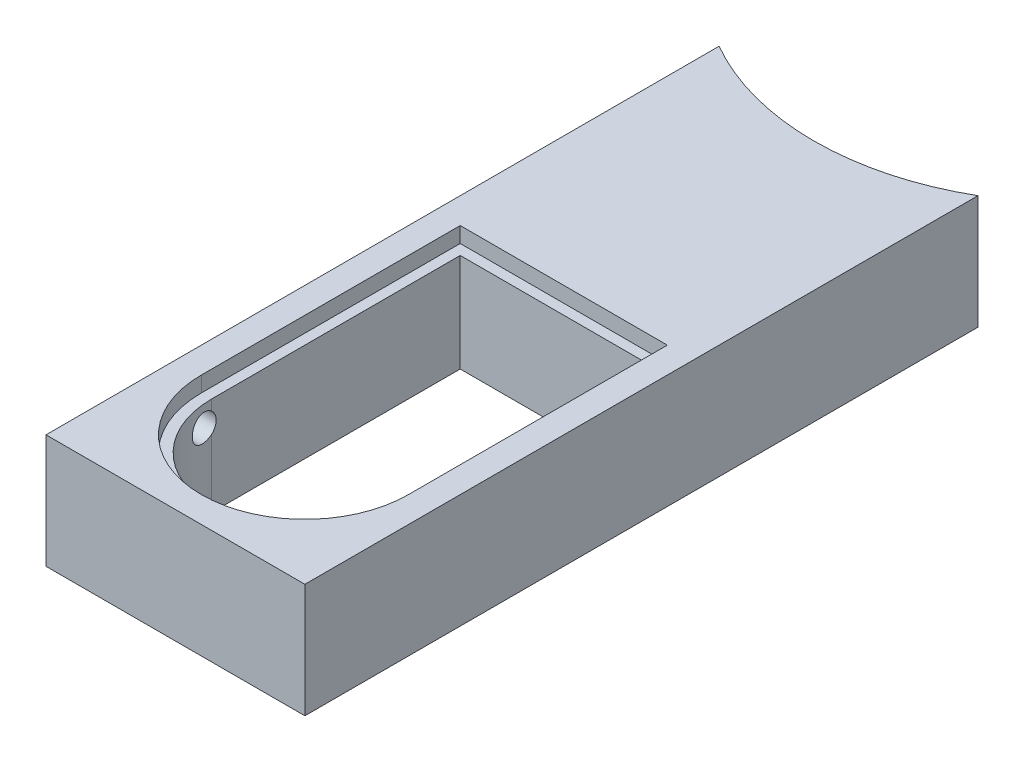
ISO-10303-21;
HEADER;
FILE_DESCRIPTION(('STEP AP214'),'2;1');
FILE_NAME('part.step','',(''),(''),'','','');
FILE_SCHEMA(('AUTOMOTIVE_DESIGN { 1 0 10303 214 1 1 1 1 }'));
ENDSEC;
DATA;
#1=APPLICATION_CONTEXT('core data for automotive mechanical design processes');
#2=APPLICATION_PROTOCOL_DEFINITION('international standard','automotive_design',2000,#1);
#3=PRODUCT_CONTEXT('',#1,'mechanical');
#4=PRODUCT('Part','Part','',(#3));
#5=PRODUCT_RELATED_PRODUCT_CATEGORY('part','',(#4));
#6=PRODUCT_DEFINITION_FORMATION('','',#4);
#7=PRODUCT_DEFINITION_CONTEXT('part definition',#1,'design');
#8=PRODUCT_DEFINITION('design','',#6,#7);
#9=PRODUCT_DEFINITION_SHAPE('','',#8);
#10=(LENGTH_UNIT() NAMED_UNIT(*) SI_UNIT(.MILLI.,.METRE.));
#11=(NAMED_UNIT(*) PLANE_ANGLE_UNIT() SI_UNIT($,.RADIAN.));
#12=(NAMED_UNIT(*) SI_UNIT($,.STERADIAN.) SOLID_ANGLE_UNIT());
#13=UNCERTAINTY_MEASURE_WITH_UNIT(LENGTH_MEASURE(1.E-05),#10,'distance_accuracy_value','');
#14=(GEOMETRIC_REPRESENTATION_CONTEXT(3) GLOBAL_UNCERTAINTY_ASSIGNED_CONTEXT((#13)) GLOBAL_UNIT_ASSIGNED_CONTEXT((#10,
#11,#12)) REPRESENTATION_CONTEXT('',''));
#15=CARTESIAN_POINT('',(0.,0.,0.));
#16=DIRECTION('',(0.,0.,1.));
#17=DIRECTION('',(1.,0.,0.));
#18=AXIS2_PLACEMENT_3D('',#15,#16,#17);
#19=CARTESIAN_POINT('',(0.,10.,0.));
#20=DIRECTION('',(0.,-1.,0.));
#21=DIRECTION('',(0.,0.,-1.));
#22=AXIS2_PLACEMENT_3D('',#19,#20,#21);
#23=CYLINDRICAL_SURFACE('',#22,20.);
#24=DIRECTION('',(0.,-1.,0.));
#25=VECTOR('',#24,1.);
#26=CARTESIAN_POINT('',(10.,10.,17.3205080756888));
#27=LINE('',#26,#25);
#28=CARTESIAN_POINT('',(10.,10.,17.3205080756888));
#29=VERTEX_POINT('',#28);
#30=CARTESIAN_POINT('',(10.,1.2,17.3205080756888));
#31=VERTEX_POINT('',#30);
#32=EDGE_CURVE('E245',#29,#31,#27,.T.);
#33=ORIENTED_EDGE('',*,*,#32,.T.);
#34=CARTESIAN_POINT('',(0.,1.2,0.));
#35=DIRECTION('',(0.,1.,0.));
#36=DIRECTION('',(0.,0.,-1.));
#37=AXIS2_PLACEMENT_3D('',#34,#35,#36);
#38=CIRCLE('',#37,20.);
#39=CARTESIAN_POINT('',(-9.99999999999999,1.2,17.3205080756888));
#40=VERTEX_POINT('',#39);
#41=EDGE_CURVE('E64',#40,#31,#38,.T.);
#42=ORIENTED_EDGE('',*,*,#41,.F.);
#43=DIRECTION('',(0.,-1.,0.));
#44=VECTOR('',#43,1.);
#45=CARTESIAN_POINT('',(-9.99999999999999,10.,17.3205080756888));
#46=LINE('',#45,#44);
#47=CARTESIAN_POINT('',(-9.99999999999999,10.,17.3205080756888));
#48=VERTEX_POINT('',#47);
#49=EDGE_CURVE('E51',#48,#40,#46,.T.);
#50=ORIENTED_EDGE('',*,*,#49,.F.);
#51=CARTESIAN_POINT('',(0.,10.,0.));
#52=DIRECTION('',(0.,1.,0.));
#53=DIRECTION('',(0.,0.,1.));
#54=AXIS2_PLACEMENT_3D('',#51,#52,#53);
#55=CIRCLE('',#54,20.);
#56=EDGE_CURVE('E234',#48,#29,#55,.T.);
#57=ORIENTED_EDGE('',*,*,#56,.T.);
#58=EDGE_LOOP('',(#33,#42,#50,#57));
#59=FACE_BOUND('',#58,.T.);
#60=ADVANCED_FACE('F38',(#59),#23,.F.);
#61=CARTESIAN_POINT('',(-10.,10.,0.));
#62=DIRECTION('',(1.,0.,0.));
#63=DIRECTION('',(0.,0.,-1.));
#64=AXIS2_PLACEMENT_3D('',#61,#62,#63);
#65=PLANE('',#64);
#66=CARTESIAN_POINT('',(-9.99999999999999,7.21457724078016,60.));
#67=DIRECTION('',(-1.,0.,0.));
#68=DIRECTION('',(0.,0.,1.));
#69=AXIS2_PLACEMENT_3D('',#66,#67,#68);
#70=CIRCLE('',#69,1.02499999999999);
#71=CARTESIAN_POINT('',(-9.99999999999999,7.21457724078016,61.025));
#72=VERTEX_POINT('',#71);
#73=EDGE_CURVE('E148',#72,#72,#70,.T.);
#74=ORIENTED_EDGE('',*,*,#73,.F.);
#75=EDGE_LOOP('',(#74));
#76=FACE_BOUND('',#75,.T.);
#77=DIRECTION('',(0.,0.,-1.));
#78=VECTOR('',#77,1.);
#79=CARTESIAN_POINT('',(-9.99999999999999,1.2,69.3205080756888));
#80=LINE('',#79,#78);
#81=CARTESIAN_POINT('',(-9.99999999999999,1.2,69.3205080756888));
#82=VERTEX_POINT('',#81);
#83=EDGE_CURVE('E261',#82,#40,#80,.T.);
#84=ORIENTED_EDGE('',*,*,#83,.F.);
#85=DIRECTION('',(0.,-1.,0.));
#86=VECTOR('',#85,1.);
#87=CARTESIAN_POINT('',(-9.99999999999999,10.,69.3205080756888));
#88=LINE('',#87,#86);
#89=CARTESIAN_POINT('',(-9.99999999999999,10.,69.3205080756888));
#90=VERTEX_POINT('',#89);
#91=EDGE_CURVE('E250',#90,#82,#88,.T.);
#92=ORIENTED_EDGE('',*,*,#91,.F.);
#93=DIRECTION('',(0.,0.,1.));
#94=VECTOR('',#93,1.);
#95=CARTESIAN_POINT('',(-10.,10.,0.));
#96=LINE('',#95,#94);
#97=EDGE_CURVE('E236',#48,#90,#96,.T.);
#98=ORIENTED_EDGE('',*,*,#97,.F.);
#99=ORIENTED_EDGE('',*,*,#49,.T.);
#100=EDGE_LOOP('',(#84,#92,#98,#99));
#101=FACE_BOUND('',#100,.T.);
#102=ADVANCED_FACE('F260',(#76,#101),#65,.F.);
#103=CARTESIAN_POINT('',(0.,10.,69.3205080756888));
#104=DIRECTION('',(0.,0.,-1.));
#105=DIRECTION('',(-1.,0.,0.));
#106=AXIS2_PLACEMENT_3D('',#103,#104,#105);
#107=PLANE('',#106);
#108=DIRECTION('',(-1.,0.,0.));
#109=VECTOR('',#108,1.);
#110=CARTESIAN_POINT('',(10.,1.2,69.3205080756888));
#111=LINE('',#110,#109);
#112=CARTESIAN_POINT('',(10.,1.2,69.3205080756888));
#113=VERTEX_POINT('',#112);
#114=EDGE_CURVE('E147',#113,#82,#111,.T.);
#115=ORIENTED_EDGE('',*,*,#114,.F.);
#116=DIRECTION('',(0.,-1.,0.));
#117=VECTOR('',#116,1.);
#118=CARTESIAN_POINT('',(10.,10.,69.3205080756888));
#119=LINE('',#118,#117);
#120=CARTESIAN_POINT('',(10.,10.,69.3205080756888));
#121=VERTEX_POINT('',#120);
#122=EDGE_CURVE('E248',#121,#113,#119,.T.);
#123=ORIENTED_EDGE('',*,*,#122,.F.);
#124=DIRECTION('',(1.,0.,0.));
#125=VECTOR('',#124,1.);
#126=CARTESIAN_POINT('',(0.,10.,69.3205080756888));
#127=LINE('',#126,#125);
#128=EDGE_CURVE('E240',#90,#121,#127,.T.);
#129=ORIENTED_EDGE('',*,*,#128,.F.);
#130=ORIENTED_EDGE('',*,*,#91,.T.);
#131=EDGE_LOOP('',(#115,#123,#129,#130));
#132=FACE_BOUND('',#131,.T.);
#133=ADVANCED_FACE('F331',(#132),#107,.F.);
#134=CARTESIAN_POINT('',(9.99999999999999,10.,0.));
#135=DIRECTION('',(1.,0.,0.));
#136=DIRECTION('',(0.,0.,-1.));
#137=AXIS2_PLACEMENT_3D('',#134,#135,#136);
#138=PLANE('',#137);
#139=ORIENTED_EDGE('',*,*,#122,.T.);
#140=DIRECTION('',(0.,0.,1.));
#141=VECTOR('',#140,1.);
#142=CARTESIAN_POINT('',(10.,1.2,69.3205080756888));
#143=LINE('',#142,#141);
#144=EDGE_CURVE('E265',#31,#113,#143,.T.);
#145=ORIENTED_EDGE('',*,*,#144,.F.);
#146=ORIENTED_EDGE('',*,*,#32,.F.);
#147=DIRECTION('',(0.,0.,1.));
#148=VECTOR('',#147,1.);
#149=CARTESIAN_POINT('',(9.99999999999999,10.,0.));
#150=LINE('',#149,#148);
#151=EDGE_CURVE('E242',#29,#121,#150,.T.);
#152=ORIENTED_EDGE('',*,*,#151,.T.);
#153=EDGE_LOOP('',(#139,#145,#146,#152));
#154=FACE_BOUND('',#153,.T.);
#155=ADVANCED_FACE('F336',(#154),#138,.T.);
#156=CARTESIAN_POINT('',(0.,10.,0.));
#157=DIRECTION('',(0.,1.,0.));
#158=DIRECTION('',(0.,0.,1.));
#159=AXIS2_PLACEMENT_3D('',#156,#157,#158);
#160=PLANE('',#159);
#161=DIRECTION('',(1.,0.,0.));
#162=VECTOR('',#161,1.);
#163=CARTESIAN_POINT('',(0.,10.,39.3205080756888));
#164=LINE('',#163,#162);
#165=CARTESIAN_POINT('',(-8.,10.,39.3205080756888));
#166=VERTEX_POINT('',#165);
#167=CARTESIAN_POINT('',(8.,10.,39.3205080756888));
#168=VERTEX_POINT('',#167);
#169=EDGE_CURVE('E198',#166,#168,#164,.T.);
#170=ORIENTED_EDGE('',*,*,#169,.T.);
#171=DIRECTION('',(0.,0.,-1.));
#172=VECTOR('',#171,1.);
#173=CARTESIAN_POINT('',(8.,10.,0.));
#174=LINE('',#173,#172);
#175=CARTESIAN_POINT('',(8.,10.,59.3205080756888));
#176=VERTEX_POINT('',#175);
#177=EDGE_CURVE('E187',#176,#168,#174,.T.);
#178=ORIENTED_EDGE('',*,*,#177,.F.);
#179=CARTESIAN_POINT('',(0.,10.,59.3205080756888));
#180=DIRECTION('',(0.,1.,0.));
#181=DIRECTION('',(0.,0.,1.));
#182=AXIS2_PLACEMENT_3D('',#179,#180,#181);
#183=CIRCLE('',#182,8.);
#184=CARTESIAN_POINT('',(-8.,10.,59.3205080756888));
#185=VERTEX_POINT('',#184);
#186=EDGE_CURVE('E231',#185,#176,#183,.T.);
#187=ORIENTED_EDGE('',*,*,#186,.F.);
#188=DIRECTION('',(0.,0.,-1.));
#189=VECTOR('',#188,1.);
#190=CARTESIAN_POINT('',(-8.,10.,0.));
#191=LINE('',#190,#189);
#192=EDGE_CURVE('E193',#185,#166,#191,.T.);
#193=ORIENTED_EDGE('',*,*,#192,.T.);
#194=EDGE_LOOP('',(#170,#178,#187,#193));
#195=FACE_BOUND('',#194,.T.);
#196=ORIENTED_EDGE('',*,*,#56,.F.);
#197=ORIENTED_EDGE('',*,*,#97,.T.);
#198=ORIENTED_EDGE('',*,*,#128,.T.);
#199=ORIENTED_EDGE('',*,*,#151,.F.);
#200=EDGE_LOOP('',(#196,#197,#198,#199));
#201=FACE_BOUND('',#200,.T.);
#202=ADVANCED_FACE('F228',(#195,#201),#160,.T.);
#203=CARTESIAN_POINT('',(0.,1.2,39.3205080756888));
#204=DIRECTION('',(0.,0.,1.));
#205=DIRECTION('',(1.,0.,0.));
#206=AXIS2_PLACEMENT_3D('',#203,#204,#205);
#207=PLANE('',#206);
#208=DIRECTION('',(0.,1.,0.));
#209=VECTOR('',#208,1.);
#210=CARTESIAN_POINT('',(8.,1.2,39.3205080756888));
#211=LINE('',#210,#209);
#212=CARTESIAN_POINT('',(8.,8.8,39.3205080756888));
#213=VERTEX_POINT('',#212);
#214=EDGE_CURVE('E171',#213,#168,#211,.T.);
#215=ORIENTED_EDGE('',*,*,#214,.T.);
#216=ORIENTED_EDGE('',*,*,#169,.F.);
#217=DIRECTION('',(0.,1.,0.));
#218=VECTOR('',#217,1.);
#219=CARTESIAN_POINT('',(-8.,1.2,39.3205080756888));
#220=LINE('',#219,#218);
#221=CARTESIAN_POINT('',(-8.,8.8,39.3205080756888));
#222=VERTEX_POINT('',#221);
#223=EDGE_CURVE('E185',#222,#166,#220,.T.);
#224=ORIENTED_EDGE('',*,*,#223,.F.);
#225=DIRECTION('',(-1.,0.,0.));
#226=VECTOR('',#225,1.);
#227=CARTESIAN_POINT('',(-8.,8.8,39.3205080756888));
#228=LINE('',#227,#226);
#229=EDGE_CURVE('E164',#213,#222,#228,.T.);
#230=ORIENTED_EDGE('',*,*,#229,.F.);
#231=EDGE_LOOP('',(#215,#216,#224,#230));
#232=FACE_BOUND('',#231,.T.);
#233=ADVANCED_FACE('F225',(#232),#207,.T.);
#234=CARTESIAN_POINT('',(0.,0.,59.3205080756888));
#235=DIRECTION('',(0.,1.,0.));
#236=DIRECTION('',(0.,0.,1.));
#237=AXIS2_PLACEMENT_3D('',#234,#235,#236);
#238=CYLINDRICAL_SURFACE('',#237,8.);
#239=DIRECTION('',(0.,1.,0.));
#240=VECTOR('',#239,1.);
#241=CARTESIAN_POINT('',(8.,1.2,59.3205080756888));
#242=LINE('',#241,#240);
#243=CARTESIAN_POINT('',(8.,8.8,59.3205080756888));
#244=VERTEX_POINT('',#243);
#245=EDGE_CURVE('E168',#244,#176,#242,.T.);
#246=ORIENTED_EDGE('',*,*,#245,.F.);
#247=CARTESIAN_POINT('',(0.,8.8,59.3205080756888));
#248=DIRECTION('',(0.,1.,0.));
#249=DIRECTION('',(0.,0.,1.));
#250=AXIS2_PLACEMENT_3D('',#247,#248,#249);
#251=CIRCLE('',#250,8.);
#252=CARTESIAN_POINT('',(-8.,8.8,59.3205080756888));
#253=VERTEX_POINT('',#252);
#254=EDGE_CURVE('E208',#253,#244,#251,.T.);
#255=ORIENTED_EDGE('',*,*,#254,.F.);
#256=DIRECTION('',(0.,1.,0.));
#257=VECTOR('',#256,1.);
#258=CARTESIAN_POINT('',(-8.,1.2,59.3205080756888));
#259=LINE('',#258,#257);
#260=EDGE_CURVE('E172',#253,#185,#259,.T.);
#261=ORIENTED_EDGE('',*,*,#260,.T.);
#262=ORIENTED_EDGE('',*,*,#186,.T.);
#263=EDGE_LOOP('',(#246,#255,#261,#262));
#264=FACE_BOUND('',#263,.T.);
#265=ADVANCED_FACE('F344',(#264),#238,.F.);
#266=CARTESIAN_POINT('',(8.,1.2,0.));
#267=DIRECTION('',(1.,0.,0.));
#268=DIRECTION('',(0.,0.,-1.));
#269=AXIS2_PLACEMENT_3D('',#266,#267,#268);
#270=PLANE('',#269);
#271=ORIENTED_EDGE('',*,*,#214,.F.);
#272=DIRECTION('',(0.,0.,-1.));
#273=VECTOR('',#272,1.);
#274=CARTESIAN_POINT('',(8.,8.8,59.3205080756888));
#275=LINE('',#274,#273);
#276=EDGE_CURVE('E205',#244,#213,#275,.T.);
#277=ORIENTED_EDGE('',*,*,#276,.F.);
#278=ORIENTED_EDGE('',*,*,#245,.T.);
#279=ORIENTED_EDGE('',*,*,#177,.T.);
#280=EDGE_LOOP('',(#271,#277,#278,#279));
#281=FACE_BOUND('',#280,.T.);
#282=ADVANCED_FACE('F347',(#281),#270,.F.);
#283=CARTESIAN_POINT('',(-8.,1.2,0.));
#284=DIRECTION('',(1.,0.,0.));
#285=DIRECTION('',(0.,0.,-1.));
#286=AXIS2_PLACEMENT_3D('',#283,#284,#285);
#287=PLANE('',#286);
#288=DIRECTION('',(0.,0.,1.));
#289=VECTOR('',#288,1.);
#290=CARTESIAN_POINT('',(-8.,8.8,39.3205080756888));
#291=LINE('',#290,#289);
#292=EDGE_CURVE('E202',#222,#253,#291,.T.);
#293=ORIENTED_EDGE('',*,*,#292,.F.);
#294=ORIENTED_EDGE('',*,*,#223,.T.);
#295=ORIENTED_EDGE('',*,*,#192,.F.);
#296=ORIENTED_EDGE('',*,*,#260,.F.);
#297=EDGE_LOOP('',(#293,#294,#295,#296));
#298=FACE_BOUND('',#297,.T.);
#299=ADVANCED_FACE('F222',(#298),#287,.T.);
#300=CARTESIAN_POINT('',(0.,8.8,0.));
#301=DIRECTION('',(0.,1.,0.));
#302=DIRECTION('',(0.,0.,1.));
#303=AXIS2_PLACEMENT_3D('',#300,#301,#302);
#304=PLANE('',#303);
#305=ORIENTED_EDGE('',*,*,#229,.T.);
#306=ORIENTED_EDGE('',*,*,#292,.T.);
#307=ORIENTED_EDGE('',*,*,#254,.T.);
#308=ORIENTED_EDGE('',*,*,#276,.T.);
#309=EDGE_LOOP('',(#305,#306,#307,#308));
#310=FACE_BOUND('',#309,.T.);
#311=CARTESIAN_POINT('',(0.,8.8,59.3205080756888));
#312=DIRECTION('',(0.,-1.,0.));
#313=DIRECTION('',(0.,0.,1.));
#314=AXIS2_PLACEMENT_3D('',#311,#312,#313);
#315=CIRCLE('',#314,7.2);
#316=CARTESIAN_POINT('',(7.2,8.8,59.3205080756888));
#317=VERTEX_POINT('',#316);
#318=CARTESIAN_POINT('',(-7.2,8.8,59.3205080756888));
#319=VERTEX_POINT('',#318);
#320=EDGE_CURVE('E273',#317,#319,#315,.T.);
#321=ORIENTED_EDGE('',*,*,#320,.T.);
#322=DIRECTION('',(0.,0.,-1.));
#323=VECTOR('',#322,1.);
#324=CARTESIAN_POINT('',(-7.2,8.8,59.3205080756888));
#325=LINE('',#324,#323);
#326=CARTESIAN_POINT('',(-7.2,8.8,40.1205080756888));
#327=VERTEX_POINT('',#326);
#328=EDGE_CURVE('E157',#319,#327,#325,.T.);
#329=ORIENTED_EDGE('',*,*,#328,.T.);
#330=DIRECTION('',(1.,0.,0.));
#331=VECTOR('',#330,1.);
#332=CARTESIAN_POINT('',(7.2,8.8,40.1205080756888));
#333=LINE('',#332,#331);
#334=CARTESIAN_POINT('',(7.2,8.8,40.1205080756888));
#335=VERTEX_POINT('',#334);
#336=EDGE_CURVE('E281',#327,#335,#333,.T.);
#337=ORIENTED_EDGE('',*,*,#336,.T.);
#338=DIRECTION('',(0.,0.,1.));
#339=VECTOR('',#338,1.);
#340=CARTESIAN_POINT('',(7.2,8.8,49.3205080756888));
#341=LINE('',#340,#339);
#342=EDGE_CURVE('E295',#335,#317,#341,.T.);
#343=ORIENTED_EDGE('',*,*,#342,.T.);
#344=EDGE_LOOP('',(#321,#329,#337,#343));
#345=FACE_BOUND('',#344,.T.);
#346=ADVANCED_FACE('F219',(#310,#345),#304,.T.);
#347=CARTESIAN_POINT('',(-7.2,1.2,59.3205080756888));
#348=DIRECTION('',(1.,0.,0.));
#349=DIRECTION('',(0.,0.,-1.));
#350=AXIS2_PLACEMENT_3D('',#347,#348,#349);
#351=PLANE('',#350);
#352=CARTESIAN_POINT('',(-7.2,7.21457724078016,60.));
#353=DIRECTION('',(1.,0.,0.));
#354=DIRECTION('',(0.,0.,-1.));
#355=AXIS2_PLACEMENT_3D('',#352,#353,#354);
#356=CIRCLE('',#355,1.02499999999999);
#357=CARTESIAN_POINT('',(-7.2,6.44716879360498,59.3205080756888));
#358=VERTEX_POINT('',#357);
#359=CARTESIAN_POINT('',(-7.2,7.98198568795533,59.3205080756888));
#360=VERTEX_POINT('',#359);
#361=EDGE_CURVE('E56',#358,#360,#356,.T.);
#362=ORIENTED_EDGE('',*,*,#361,.F.);
#363=DIRECTION('',(0.,1.,0.));
#364=VECTOR('',#363,1.);
#365=CARTESIAN_POINT('',(-7.2,1.2,59.3205080756888));
#366=LINE('',#365,#364);
#367=CARTESIAN_POINT('',(-7.2,1.2,59.3205080756888));
#368=VERTEX_POINT('',#367);
#369=EDGE_CURVE('E143',#368,#358,#366,.T.);
#370=ORIENTED_EDGE('',*,*,#369,.F.);
#371=DIRECTION('',(0.,0.,-1.));
#372=VECTOR('',#371,1.);
#373=CARTESIAN_POINT('',(-7.2,1.2,59.3205080756888));
#374=LINE('',#373,#372);
#375=CARTESIAN_POINT('',(-7.2,1.2,40.1205080756888));
#376=VERTEX_POINT('',#375);
#377=EDGE_CURVE('E153',#368,#376,#374,.T.);
#378=ORIENTED_EDGE('',*,*,#377,.T.);
#379=DIRECTION('',(0.,1.,0.));
#380=VECTOR('',#379,1.);
#381=CARTESIAN_POINT('',(-7.2,1.2,40.1205080756888));
#382=LINE('',#381,#380);
#383=EDGE_CURVE('E155',#376,#327,#382,.T.);
#384=ORIENTED_EDGE('',*,*,#383,.T.);
#385=ORIENTED_EDGE('',*,*,#328,.F.);
#386=EDGE_CURVE('E146',#360,#319,#366,.T.);
#387=ORIENTED_EDGE('',*,*,#386,.F.);
#388=EDGE_LOOP('',(#362,#370,#378,#384,#385,#387));
#389=FACE_BOUND('',#388,.T.);
#390=ADVANCED_FACE('F141',(#389),#351,.T.);
#391=CARTESIAN_POINT('',(0.,1.2,59.3205080756888));
#392=DIRECTION('',(0.,1.,0.));
#393=DIRECTION('',(0.,0.,1.));
#394=AXIS2_PLACEMENT_3D('',#391,#392,#393);
#395=CYLINDRICAL_SURFACE('',#394,7.2);
#396=CARTESIAN_POINT('',(-7.2,7.98198568795533,59.3205080756888));
#397=CARTESIAN_POINT('',(-7.20000010677547,8.00098104206782,59.3419613741656));
#398=CARTESIAN_POINT('',(-7.19990397119566,8.01906750713669,59.364201457006));
#399=CARTESIAN_POINT('',(-7.19947904135888,8.05331514265426,59.4101145759415));
#400=CARTESIAN_POINT('',(-7.19915025300894,8.06947636197263,59.4337875756412));
#401=CARTESIAN_POINT('',(-7.19775617281243,8.11486253029742,59.5066668726488));
#402=CARTESIAN_POINT('',(-7.1962834285545,8.14105305953924,59.5578048438434));
#403=CARTESIAN_POINT('',(-7.19201195828801,8.18452705951076,59.6636903019943));
#404=CARTESIAN_POINT('',(-7.18921244546801,8.2018052322458,59.7184399141501));
#405=CARTESIAN_POINT('',(-7.1821709663558,8.22698775420452,59.8299564422109));
#406=CARTESIAN_POINT('',(-7.17792935953899,8.23489443728819,59.8867228522275));
#407=CARTESIAN_POINT('',(-7.16803514376559,8.24116157020493,60.0006088575837));
#408=CARTESIAN_POINT('',(-7.16238362897386,8.23952940077791,60.0577281457036));
#409=CARTESIAN_POINT('',(-7.14984404595422,8.22684938226904,60.1707825668511));
#410=CARTESIAN_POINT('',(-7.14295568745995,8.21579932068118,60.2267174184592));
#411=CARTESIAN_POINT('',(-7.12818196040019,8.18448504776462,60.3364409215572));
#412=CARTESIAN_POINT('',(-7.12028703134315,8.1641268709762,60.3902014478562));
#413=CARTESIAN_POINT('',(-7.10399860873729,8.11477025116796,60.4935135308935));
#414=CARTESIAN_POINT('',(-7.09560509772066,8.08577150528281,60.5430649400173));
#415=CARTESIAN_POINT('',(-7.07872077542571,8.01943457784853,60.6373382658902));
#416=CARTESIAN_POINT('',(-7.07023034983523,7.98197996043969,60.6819783870654));
#417=CARTESIAN_POINT('',(-7.05387258339116,7.89998742731337,60.7643392335139));
#418=CARTESIAN_POINT('',(-7.04600527259645,7.85544917019453,60.8020596250968));
#419=CARTESIAN_POINT('',(-7.03149467786054,7.76050688065081,60.8694672326827));
#420=CARTESIAN_POINT('',(-7.02485083455179,7.71010554610087,60.8991581226861));
#421=CARTESIAN_POINT('',(-7.01332575884918,7.60482516210286,60.9495983449808));
#422=CARTESIAN_POINT('',(-7.00844424862364,7.5499468201285,60.9703490867857));
#423=CARTESIAN_POINT('',(-7.00094855225209,7.43854052619884,61.0018700585001));
#424=CARTESIAN_POINT('',(-6.99828738023087,7.38207437650573,61.0128474634883));
#425=CARTESIAN_POINT('',(-6.99528670069301,7.26804369787141,61.0252092312491));
#426=CARTESIAN_POINT('',(-6.99494685940992,7.21047932802848,61.0265949731341));
#427=CARTESIAN_POINT('',(-6.99660000097394,7.09717592294988,61.0198017041216));
#428=CARTESIAN_POINT('',(-6.99854399128412,7.04142398094166,61.0118235696638));
#429=CARTESIAN_POINT('',(-7.00452064612138,6.93208260071536,60.9868972691041));
#430=CARTESIAN_POINT('',(-7.00855333885147,6.87849319170773,60.9699489818813));
#431=CARTESIAN_POINT('',(-7.0184006884003,6.77473124889787,60.9275316174355));
#432=CARTESIAN_POINT('',(-7.02422236736652,6.72457314954124,60.902028925601));
#433=CARTESIAN_POINT('',(-7.03719301346739,6.62921298921822,60.8432741791858));
#434=CARTESIAN_POINT('',(-7.04434215823421,6.58401159281211,60.8100210873488));
#435=CARTESIAN_POINT('',(-7.05963355699093,6.49868431260485,60.7357962039845));
#436=CARTESIAN_POINT('',(-7.0677955790437,6.45870685029214,60.6946578335243));
#437=CARTESIAN_POINT('',(-7.08439596693923,6.38617543789463,60.6063347173573));
#438=CARTESIAN_POINT('',(-7.09283436028412,6.3536222291912,60.5591493685374));
#439=CARTESIAN_POINT('',(-7.10958711424765,6.2962979416272,60.4590972976753));
#440=CARTESIAN_POINT('',(-7.11789660750846,6.27167540280754,60.406144529952));
#441=CARTESIAN_POINT('',(-7.13372669293844,6.23173857521992,60.2967235323985));
#442=CARTESIAN_POINT('',(-7.14124728194344,6.21642432378491,60.2402552884699));
#443=CARTESIAN_POINT('',(-7.15507396865424,6.19564744598349,60.1256373140294));
#444=CARTESIAN_POINT('',(-7.16138507322392,6.19014338636304,60.0674957143376));
#445=CARTESIAN_POINT('',(-7.17258135181228,6.18909439163622,59.9509842391722));
#446=CARTESIAN_POINT('',(-7.17746664580207,6.19354861834252,59.8926143833238));
#447=CARTESIAN_POINT('',(-7.18565993845065,6.21219956972537,59.7782538839648));
#448=CARTESIAN_POINT('',(-7.1889906126415,6.22624835863421,59.7222406352364));
#449=CARTESIAN_POINT('',(-7.19425016779139,6.2635729193317,59.6133146875142));
#450=CARTESIAN_POINT('',(-7.19617969430136,6.28684443428357,59.5604005710011));
#451=CARTESIAN_POINT('',(-7.19840382529972,6.33286109237589,59.475882839559));
#452=CARTESIAN_POINT('',(-7.19902731854282,6.35326640206698,59.4429901416951));
#453=CARTESIAN_POINT('',(-7.1998259068547,6.39762305458342,59.3797560613601));
#454=CARTESIAN_POINT('',(-7.20000166087679,6.42156913131689,59.3494109931831));
#455=CARTESIAN_POINT('',(-7.2,6.44716879360498,59.3205080756888));
#456=B_SPLINE_CURVE_WITH_KNOTS('',3,(#396,#397,#398,#399,#400,#401,#402,#403,#404,#405,#406,
#407,#408,#409,#410,#411,#412,#413,#414,#415,#416,#417,#418,#419,#420,#421,#422,#423,#424,#425,
#426,#427,#428,#429,#430,#431,#432,#433,#434,#435,#436,#437,#438,#439,#440,#441,#442,#443,#444,
#445,#446,#447,#448,#449,#450,#451,#452,#453,#454,#455),.UNSPECIFIED.,.F.,.F.,(4,2,2,2,2,2,2,2,
2,2,2,2,2,2,2,2,2,2,2,2,2,2,2,2,2,2,2,2,2,4),(0.,0.0859105538714203,0.171818926559221,
0.343353555303674,0.514990036485679,0.686583764620575,0.858044738746241,1.0295460045879,
1.20281816151381,1.37609639261166,1.55192441746075,1.72776091904384,1.90351682775207,
2.07924501644344,2.25115275578178,2.42303577729734,2.5912979053486,2.75956230544337,
2.92849580262109,3.097451921607,3.27047634733615,3.44351804361939,3.61963415215712,
3.79575096704289,3.97112217564443,4.14647862383556,4.3191905906412,4.4918229332675,
4.60772842235395,4.72346323051058),.UNSPECIFIED.);
#457=EDGE_CURVE('E12',#360,#358,#456,.T.);
#458=ORIENTED_EDGE('',*,*,#457,.F.);
#459=ORIENTED_EDGE('',*,*,#386,.T.);
#460=ORIENTED_EDGE('',*,*,#320,.F.);
#461=DIRECTION('',(0.,1.,0.));
#462=VECTOR('',#461,1.);
#463=CARTESIAN_POINT('',(7.2,1.2,59.3205080756888));
#464=LINE('',#463,#462);
#465=CARTESIAN_POINT('',(7.2,1.2,59.3205080756888));
#466=VERTEX_POINT('',#465);
#467=EDGE_CURVE('E306',#466,#317,#464,.T.);
#468=ORIENTED_EDGE('',*,*,#467,.F.);
#469=CARTESIAN_POINT('',(0.,1.2,59.3205080756888));
#470=DIRECTION('',(0.,-1.,0.));
#471=DIRECTION('',(0.,0.,1.));
#472=AXIS2_PLACEMENT_3D('',#469,#470,#471);
#473=CIRCLE('',#472,7.2);
#474=EDGE_CURVE('E152',#466,#368,#473,.T.);
#475=ORIENTED_EDGE('',*,*,#474,.T.);
#476=ORIENTED_EDGE('',*,*,#369,.T.);
#477=EDGE_LOOP('',(#458,#459,#460,#468,#475,#476));
#478=FACE_BOUND('',#477,.T.);
#479=ADVANCED_FACE('F150',(#478),#395,.F.);
#480=CARTESIAN_POINT('',(7.2,1.2,49.3205080756888));
#481=DIRECTION('',(-1.,0.,0.));
#482=DIRECTION('',(0.,0.,1.));
#483=AXIS2_PLACEMENT_3D('',#480,#481,#482);
#484=PLANE('',#483);
#485=ORIENTED_EDGE('',*,*,#342,.F.);
#486=DIRECTION('',(0.,1.,0.));
#487=VECTOR('',#486,1.);
#488=CARTESIAN_POINT('',(7.2,1.2,40.1205080756888));
#489=LINE('',#488,#487);
#490=CARTESIAN_POINT('',(7.2,1.2,40.1205080756888));
#491=VERTEX_POINT('',#490);
#492=EDGE_CURVE('E293',#491,#335,#489,.T.);
#493=ORIENTED_EDGE('',*,*,#492,.F.);
#494=DIRECTION('',(0.,0.,1.));
#495=VECTOR('',#494,1.);
#496=CARTESIAN_POINT('',(7.2,1.2,49.3205080756888));
#497=LINE('',#496,#495);
#498=EDGE_CURVE('E290',#491,#466,#497,.T.);
#499=ORIENTED_EDGE('',*,*,#498,.T.);
#500=ORIENTED_EDGE('',*,*,#467,.T.);
#501=EDGE_LOOP('',(#485,#493,#499,#500));
#502=FACE_BOUND('',#501,.T.);
#503=ADVANCED_FACE('F320',(#502),#484,.T.);
#504=CARTESIAN_POINT('',(7.2,1.2,40.1205080756888));
#505=DIRECTION('',(0.,0.,1.));
#506=DIRECTION('',(1.,0.,0.));
#507=AXIS2_PLACEMENT_3D('',#504,#505,#506);
#508=PLANE('',#507);
#509=ORIENTED_EDGE('',*,*,#336,.F.);
#510=ORIENTED_EDGE('',*,*,#383,.F.);
#511=DIRECTION('',(1.,0.,0.));
#512=VECTOR('',#511,1.);
#513=CARTESIAN_POINT('',(7.2,1.2,40.1205080756888));
#514=LINE('',#513,#512);
#515=EDGE_CURVE('E278',#376,#491,#514,.T.);
#516=ORIENTED_EDGE('',*,*,#515,.T.);
#517=ORIENTED_EDGE('',*,*,#492,.T.);
#518=EDGE_LOOP('',(#509,#510,#516,#517));
#519=FACE_BOUND('',#518,.T.);
#520=ADVANCED_FACE('F317',(#519),#508,.T.);
#521=CARTESIAN_POINT('',(0.,1.2,0.));
#522=DIRECTION('',(0.,-1.,0.));
#523=DIRECTION('',(0.,0.,-1.));
#524=AXIS2_PLACEMENT_3D('',#521,#522,#523);
#525=PLANE('',#524);
#526=ORIENTED_EDGE('',*,*,#377,.F.);
#527=ORIENTED_EDGE('',*,*,#474,.F.);
#528=ORIENTED_EDGE('',*,*,#498,.F.);
#529=ORIENTED_EDGE('',*,*,#515,.F.);
#530=EDGE_LOOP('',(#526,#527,#528,#529));
#531=FACE_BOUND('',#530,.T.);
#532=ORIENTED_EDGE('',*,*,#114,.T.);
#533=ORIENTED_EDGE('',*,*,#83,.T.);
#534=ORIENTED_EDGE('',*,*,#41,.T.);
#535=ORIENTED_EDGE('',*,*,#144,.T.);
#536=EDGE_LOOP('',(#532,#533,#534,#535));
#537=FACE_BOUND('',#536,.T.);
#538=ADVANCED_FACE('F322',(#531,#537),#525,.T.);
#539=CARTESIAN_POINT('',(-9.99999999999999,7.21457724078016,60.));
#540=DIRECTION('',(-1.,0.,0.));
#541=DIRECTION('',(0.,0.,1.));
#542=AXIS2_PLACEMENT_3D('',#539,#540,#541);
#543=CYLINDRICAL_SURFACE('',#542,1.02499999999999);
#544=ORIENTED_EDGE('',*,*,#361,.T.);
#545=ORIENTED_EDGE('',*,*,#457,.T.);
#546=EDGE_LOOP('',(#544,#545));
#547=FACE_BOUND('',#546,.T.);
#548=ORIENTED_EDGE('',*,*,#73,.T.);
#549=EDGE_LOOP('',(#548));
#550=FACE_BOUND('',#549,.T.);
#551=ADVANCED_FACE('F134',(#547,#550),#543,.F.);
#552=CLOSED_SHELL('',(#60,#102,#133,#155,#202,#233,#265,#282,#299,#346,#390,#479,#503,#520,#538,#551));
#553=MANIFOLD_SOLID_BREP('B2',#552);
#554=ADVANCED_BREP_SHAPE_REPRESENTATION('',(#18,#553),#14);
#555=SHAPE_DEFINITION_REPRESENTATION(#9,#554);
ENDSEC;
END-ISO-10303-21;
